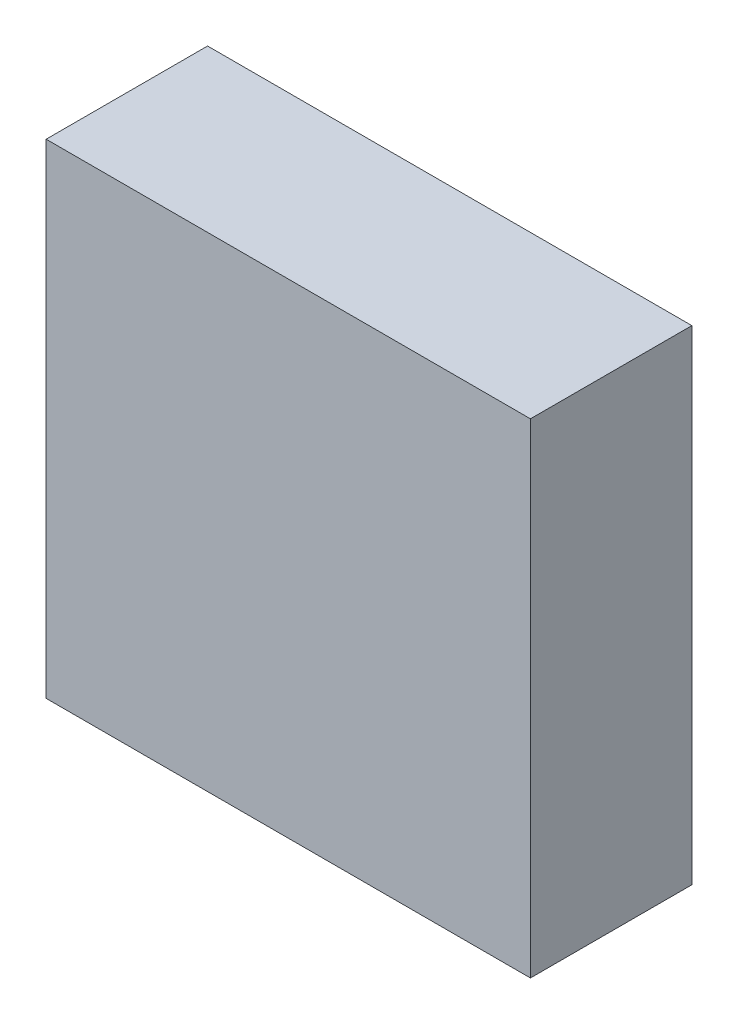
ISO-10303-21;
HEADER;
FILE_DESCRIPTION(('STEP AP214'),'2;1');
FILE_NAME('part.step','',(''),(''),'','','');
FILE_SCHEMA(('AUTOMOTIVE_DESIGN { 1 0 10303 214 1 1 1 1 }'));
ENDSEC;
DATA;
#1=APPLICATION_CONTEXT('core data for automotive mechanical design processes');
#2=APPLICATION_PROTOCOL_DEFINITION('international standard','automotive_design',2000,#1);
#3=PRODUCT_CONTEXT('',#1,'mechanical');
#4=PRODUCT('Part','Part','',(#3));
#5=PRODUCT_RELATED_PRODUCT_CATEGORY('part','',(#4));
#6=PRODUCT_DEFINITION_FORMATION('','',#4);
#7=PRODUCT_DEFINITION_CONTEXT('part definition',#1,'design');
#8=PRODUCT_DEFINITION('design','',#6,#7);
#9=PRODUCT_DEFINITION_SHAPE('','',#8);
#10=(LENGTH_UNIT() NAMED_UNIT(*) SI_UNIT(.MILLI.,.METRE.));
#11=(NAMED_UNIT(*) PLANE_ANGLE_UNIT() SI_UNIT($,.RADIAN.));
#12=(NAMED_UNIT(*) SI_UNIT($,.STERADIAN.) SOLID_ANGLE_UNIT());
#13=UNCERTAINTY_MEASURE_WITH_UNIT(LENGTH_MEASURE(1.E-05),#10,'distance_accuracy_value','');
#14=(GEOMETRIC_REPRESENTATION_CONTEXT(3) GLOBAL_UNCERTAINTY_ASSIGNED_CONTEXT((#13)) GLOBAL_UNIT_ASSIGNED_CONTEXT((#10,
#11,#12)) REPRESENTATION_CONTEXT('',''));
#15=CARTESIAN_POINT('',(0.,0.,0.));
#16=DIRECTION('',(0.,0.,1.));
#17=DIRECTION('',(1.,0.,0.));
#18=AXIS2_PLACEMENT_3D('',#15,#16,#17);
#19=CARTESIAN_POINT('',(-31.215909038559,27.9230916294283,10.));
#20=DIRECTION('',(1.,0.,0.));
#21=DIRECTION('',(0.,1.,0.));
#22=AXIS2_PLACEMENT_3D('',#19,#20,#21);
#23=PLANE('',#22);
#24=DIRECTION('',(0.,-1.,0.));
#25=VECTOR('',#24,1.);
#26=CARTESIAN_POINT('',(-31.215909038559,27.9230916294283,0.));
#27=LINE('',#26,#25);
#28=CARTESIAN_POINT('',(-31.215909038559,27.9230916294283,0.));
#29=VERTEX_POINT('',#28);
#30=CARTESIAN_POINT('',(-31.215909038559,-2.0769083705717,0.));
#31=VERTEX_POINT('',#30);
#32=EDGE_CURVE('E107',#29,#31,#27,.T.);
#33=ORIENTED_EDGE('',*,*,#32,.T.);
#34=DIRECTION('',(0.,0.,-1.));
#35=VECTOR('',#34,1.);
#36=CARTESIAN_POINT('',(-31.215909038559,-2.0769083705717,10.));
#37=LINE('',#36,#35);
#38=CARTESIAN_POINT('',(-31.215909038559,-2.0769083705717,10.));
#39=VERTEX_POINT('',#38);
#40=EDGE_CURVE('E11',#39,#31,#37,.T.);
#41=ORIENTED_EDGE('',*,*,#40,.F.);
#42=DIRECTION('',(0.,-1.,0.));
#43=VECTOR('',#42,1.);
#44=CARTESIAN_POINT('',(-31.215909038559,27.9230916294283,10.));
#45=LINE('',#44,#43);
#46=CARTESIAN_POINT('',(-31.215909038559,27.9230916294283,10.));
#47=VERTEX_POINT('',#46);
#48=EDGE_CURVE('E91',#47,#39,#45,.T.);
#49=ORIENTED_EDGE('',*,*,#48,.F.);
#50=DIRECTION('',(0.,0.,-1.));
#51=VECTOR('',#50,1.);
#52=CARTESIAN_POINT('',(-31.215909038559,27.9230916294283,10.));
#53=LINE('',#52,#51);
#54=EDGE_CURVE('E103',#47,#29,#53,.T.);
#55=ORIENTED_EDGE('',*,*,#54,.T.);
#56=EDGE_LOOP('',(#33,#41,#49,#55));
#57=FACE_BOUND('',#56,.T.);
#58=ADVANCED_FACE('F39',(#57),#23,.F.);
#59=CARTESIAN_POINT('',(-31.215909038559,-2.0769083705717,10.));
#60=DIRECTION('',(0.,1.,0.));
#61=DIRECTION('',(0.,0.,1.));
#62=AXIS2_PLACEMENT_3D('',#59,#60,#61);
#63=PLANE('',#62);
#64=DIRECTION('',(1.,0.,0.));
#65=VECTOR('',#64,1.);
#66=CARTESIAN_POINT('',(-31.215909038559,-2.0769083705717,0.));
#67=LINE('',#66,#65);
#68=CARTESIAN_POINT('',(-1.21590903855898,-2.0769083705717,0.));
#69=VERTEX_POINT('',#68);
#70=EDGE_CURVE('E96',#31,#69,#67,.T.);
#71=ORIENTED_EDGE('',*,*,#70,.T.);
#72=DIRECTION('',(0.,0.,-1.));
#73=VECTOR('',#72,1.);
#74=CARTESIAN_POINT('',(-1.21590903855898,-2.0769083705717,10.));
#75=LINE('',#74,#73);
#76=CARTESIAN_POINT('',(-1.21590903855898,-2.0769083705717,10.));
#77=VERTEX_POINT('',#76);
#78=EDGE_CURVE('E48',#77,#69,#75,.T.);
#79=ORIENTED_EDGE('',*,*,#78,.F.);
#80=DIRECTION('',(1.,0.,0.));
#81=VECTOR('',#80,1.);
#82=CARTESIAN_POINT('',(-31.215909038559,-2.0769083705717,10.));
#83=LINE('',#82,#81);
#84=EDGE_CURVE('E86',#39,#77,#83,.T.);
#85=ORIENTED_EDGE('',*,*,#84,.F.);
#86=ORIENTED_EDGE('',*,*,#40,.T.);
#87=EDGE_LOOP('',(#71,#79,#85,#86));
#88=FACE_BOUND('',#87,.T.);
#89=ADVANCED_FACE('F95',(#88),#63,.F.);
#90=CARTESIAN_POINT('',(-1.21590903855898,27.9230916294283,10.));
#91=DIRECTION('',(-1.,0.,0.));
#92=DIRECTION('',(0.,-1.,0.));
#93=AXIS2_PLACEMENT_3D('',#90,#91,#92);
#94=PLANE('',#93);
#95=DIRECTION('',(0.,1.,0.));
#96=VECTOR('',#95,1.);
#97=CARTESIAN_POINT('',(-1.21590903855898,27.9230916294283,0.));
#98=LINE('',#97,#96);
#99=CARTESIAN_POINT('',(-1.21590903855898,27.9230916294283,0.));
#100=VERTEX_POINT('',#99);
#101=EDGE_CURVE('E73',#69,#100,#98,.T.);
#102=ORIENTED_EDGE('',*,*,#101,.T.);
#103=DIRECTION('',(0.,0.,-1.));
#104=VECTOR('',#103,1.);
#105=CARTESIAN_POINT('',(-1.21590903855898,27.9230916294283,10.));
#106=LINE('',#105,#104);
#107=CARTESIAN_POINT('',(-1.21590903855898,27.9230916294283,10.));
#108=VERTEX_POINT('',#107);
#109=EDGE_CURVE('E98',#108,#100,#106,.T.);
#110=ORIENTED_EDGE('',*,*,#109,.F.);
#111=DIRECTION('',(0.,1.,0.));
#112=VECTOR('',#111,1.);
#113=CARTESIAN_POINT('',(-1.21590903855898,27.9230916294283,10.));
#114=LINE('',#113,#112);
#115=EDGE_CURVE('E89',#77,#108,#114,.T.);
#116=ORIENTED_EDGE('',*,*,#115,.F.);
#117=ORIENTED_EDGE('',*,*,#78,.T.);
#118=EDGE_LOOP('',(#102,#110,#116,#117));
#119=FACE_BOUND('',#118,.T.);
#120=ADVANCED_FACE('F99',(#119),#94,.F.);
#121=CARTESIAN_POINT('',(-31.215909038559,27.9230916294283,10.));
#122=DIRECTION('',(0.,-1.,0.));
#123=DIRECTION('',(0.,0.,-1.));
#124=AXIS2_PLACEMENT_3D('',#121,#122,#123);
#125=PLANE('',#124);
#126=DIRECTION('',(-1.,0.,0.));
#127=VECTOR('',#126,1.);
#128=CARTESIAN_POINT('',(-31.215909038559,27.9230916294283,0.));
#129=LINE('',#128,#127);
#130=EDGE_CURVE('E79',#100,#29,#129,.T.);
#131=ORIENTED_EDGE('',*,*,#130,.T.);
#132=ORIENTED_EDGE('',*,*,#54,.F.);
#133=DIRECTION('',(-1.,0.,0.));
#134=VECTOR('',#133,1.);
#135=CARTESIAN_POINT('',(-31.215909038559,27.9230916294283,10.));
#136=LINE('',#135,#134);
#137=EDGE_CURVE('E56',#108,#47,#136,.T.);
#138=ORIENTED_EDGE('',*,*,#137,.F.);
#139=ORIENTED_EDGE('',*,*,#109,.T.);
#140=EDGE_LOOP('',(#131,#132,#138,#139));
#141=FACE_BOUND('',#140,.T.);
#142=ADVANCED_FACE('F120',(#141),#125,.F.);
#143=CARTESIAN_POINT('',(0.,0.,10.));
#144=DIRECTION('',(0.,0.,1.));
#145=DIRECTION('',(1.,0.,0.));
#146=AXIS2_PLACEMENT_3D('',#143,#144,#145);
#147=PLANE('',#146);
#148=ORIENTED_EDGE('',*,*,#48,.T.);
#149=ORIENTED_EDGE('',*,*,#84,.T.);
#150=ORIENTED_EDGE('',*,*,#115,.T.);
#151=ORIENTED_EDGE('',*,*,#137,.T.);
#152=EDGE_LOOP('',(#148,#149,#150,#151));
#153=FACE_BOUND('',#152,.T.);
#154=ADVANCED_FACE('F87',(#153),#147,.T.);
#155=CARTESIAN_POINT('',(0.,0.,0.));
#156=DIRECTION('',(0.,0.,1.));
#157=DIRECTION('',(1.,0.,0.));
#158=AXIS2_PLACEMENT_3D('',#155,#156,#157);
#159=PLANE('',#158);
#160=ORIENTED_EDGE('',*,*,#32,.F.);
#161=ORIENTED_EDGE('',*,*,#130,.F.);
#162=ORIENTED_EDGE('',*,*,#101,.F.);
#163=ORIENTED_EDGE('',*,*,#70,.F.);
#164=EDGE_LOOP('',(#160,#161,#162,#163));
#165=FACE_BOUND('',#164,.T.);
#166=ADVANCED_FACE('F123',(#165),#159,.F.);
#167=CLOSED_SHELL('',(#58,#89,#120,#142,#154,#166));
#168=MANIFOLD_SOLID_BREP('B2',#167);
#169=ADVANCED_BREP_SHAPE_REPRESENTATION('',(#18,#168),#14);
#170=SHAPE_DEFINITION_REPRESENTATION(#9,#169);
ENDSEC;
END-ISO-10303-21;
